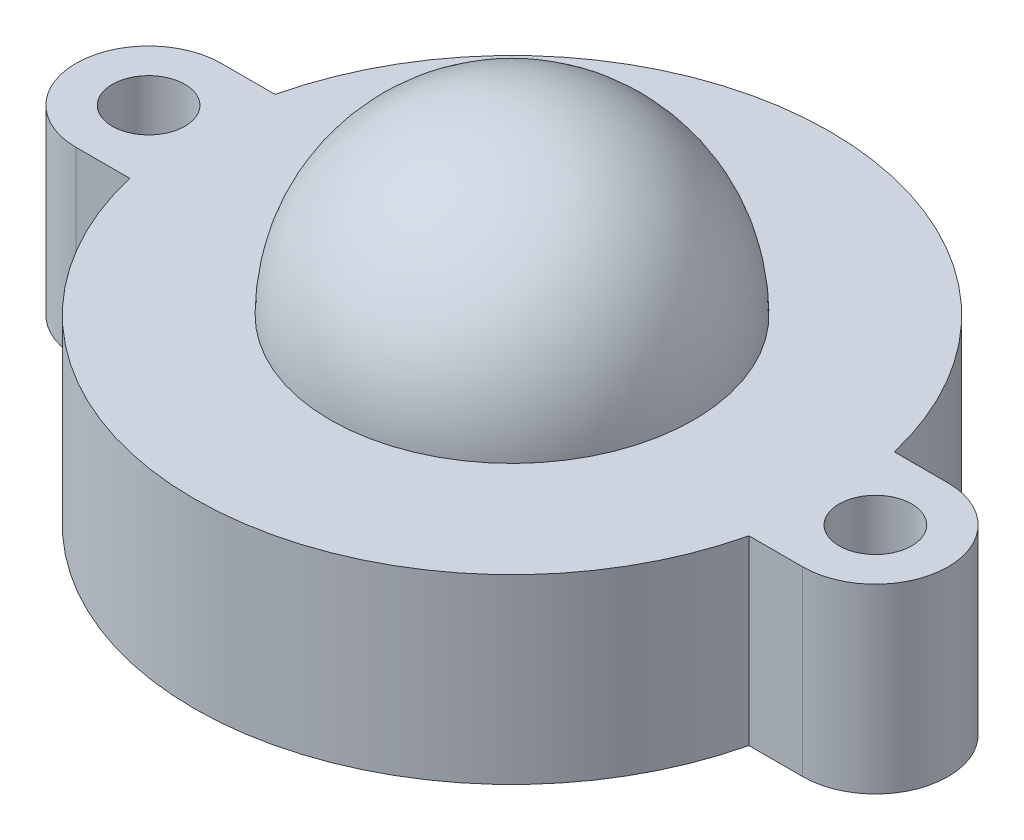
ISO-10303-21;
HEADER;
FILE_DESCRIPTION(('STEP AP214'),'2;1');
FILE_NAME('part.step','',(''),(''),'','','');
FILE_SCHEMA(('AUTOMOTIVE_DESIGN { 1 0 10303 214 1 1 1 1 }'));
ENDSEC;
DATA;
#1=APPLICATION_CONTEXT('core data for automotive mechanical design processes');
#2=APPLICATION_PROTOCOL_DEFINITION('international standard','automotive_design',2000,#1);
#3=PRODUCT_CONTEXT('',#1,'mechanical');
#4=PRODUCT('Part','Part','',(#3));
#5=PRODUCT_RELATED_PRODUCT_CATEGORY('part','',(#4));
#6=PRODUCT_DEFINITION_FORMATION('','',#4);
#7=PRODUCT_DEFINITION_CONTEXT('part definition',#1,'design');
#8=PRODUCT_DEFINITION('design','',#6,#7);
#9=PRODUCT_DEFINITION_SHAPE('','',#8);
#10=(LENGTH_UNIT() NAMED_UNIT(*) SI_UNIT(.MILLI.,.METRE.));
#11=(NAMED_UNIT(*) PLANE_ANGLE_UNIT() SI_UNIT($,.RADIAN.));
#12=(NAMED_UNIT(*) SI_UNIT($,.STERADIAN.) SOLID_ANGLE_UNIT());
#13=UNCERTAINTY_MEASURE_WITH_UNIT(LENGTH_MEASURE(1.E-05),#10,'distance_accuracy_value','');
#14=(GEOMETRIC_REPRESENTATION_CONTEXT(3) GLOBAL_UNCERTAINTY_ASSIGNED_CONTEXT((#13)) GLOBAL_UNIT_ASSIGNED_CONTEXT((#10,
#11,#12)) REPRESENTATION_CONTEXT('',''));
#15=CARTESIAN_POINT('',(0.,0.,0.));
#16=DIRECTION('',(0.,0.,1.));
#17=DIRECTION('',(1.,0.,0.));
#18=AXIS2_PLACEMENT_3D('',#15,#16,#17);
#19=CARTESIAN_POINT('',(20.,10.,0.));
#20=DIRECTION('',(0.,-1.,0.));
#21=DIRECTION('',(0.,0.,-1.));
#22=AXIS2_PLACEMENT_3D('',#19,#20,#21);
#23=CYLINDRICAL_SURFACE('',#22,4.);
#24=CARTESIAN_POINT('',(20.,0.,0.));
#25=DIRECTION('',(0.,1.,0.));
#26=DIRECTION('',(0.,0.,1.));
#27=AXIS2_PLACEMENT_3D('',#24,#25,#26);
#28=CIRCLE('',#27,4.);
#29=CARTESIAN_POINT('',(20.,0.,-4.));
#30=VERTEX_POINT('',#29);
#31=CARTESIAN_POINT('',(20.,0.,4.));
#32=VERTEX_POINT('',#31);
#33=EDGE_CURVE('E148',#30,#32,#28,.F.);
#34=ORIENTED_EDGE('',*,*,#33,.F.);
#35=DIRECTION('',(0.,-1.,0.));
#36=VECTOR('',#35,1.);
#37=CARTESIAN_POINT('',(20.,10.,-4.));
#38=LINE('',#37,#36);
#39=CARTESIAN_POINT('',(20.,10.,-4.));
#40=VERTEX_POINT('',#39);
#41=EDGE_CURVE('E11',#40,#30,#38,.T.);
#42=ORIENTED_EDGE('',*,*,#41,.F.);
#43=CARTESIAN_POINT('',(20.,10.,0.));
#44=DIRECTION('',(0.,1.,0.));
#45=DIRECTION('',(0.,0.,1.));
#46=AXIS2_PLACEMENT_3D('',#43,#44,#45);
#47=CIRCLE('',#46,4.);
#48=CARTESIAN_POINT('',(20.,10.,4.));
#49=VERTEX_POINT('',#48);
#50=EDGE_CURVE('E183',#40,#49,#47,.F.);
#51=ORIENTED_EDGE('',*,*,#50,.T.);
#52=DIRECTION('',(0.,-1.,0.));
#53=VECTOR('',#52,1.);
#54=CARTESIAN_POINT('',(20.,10.,4.));
#55=LINE('',#54,#53);
#56=EDGE_CURVE('E93',#49,#32,#55,.T.);
#57=ORIENTED_EDGE('',*,*,#56,.T.);
#58=EDGE_LOOP('',(#34,#42,#51,#57));
#59=FACE_BOUND('',#58,.T.);
#60=ADVANCED_FACE('F41',(#59),#23,.T.);
#61=CARTESIAN_POINT('',(0.,10.,-4.));
#62=DIRECTION('',(0.,0.,-1.));
#63=DIRECTION('',(-1.,0.,0.));
#64=AXIS2_PLACEMENT_3D('',#61,#62,#63);
#65=PLANE('',#64);
#66=DIRECTION('',(1.,0.,0.));
#67=VECTOR('',#66,1.);
#68=CARTESIAN_POINT('',(0.,0.,-4.));
#69=LINE('',#68,#67);
#70=CARTESIAN_POINT('',(17.0367250374008,0.,-4.));
#71=VERTEX_POINT('',#70);
#72=EDGE_CURVE('E152',#71,#30,#69,.T.);
#73=ORIENTED_EDGE('',*,*,#72,.F.);
#74=DIRECTION('',(0.,-1.,0.));
#75=VECTOR('',#74,1.);
#76=CARTESIAN_POINT('',(17.0367250374008,10.,-4.));
#77=LINE('',#76,#75);
#78=CARTESIAN_POINT('',(17.0367250374008,10.,-4.));
#79=VERTEX_POINT('',#78);
#80=EDGE_CURVE('E50',#79,#71,#77,.T.);
#81=ORIENTED_EDGE('',*,*,#80,.F.);
#82=DIRECTION('',(1.,0.,0.));
#83=VECTOR('',#82,1.);
#84=CARTESIAN_POINT('',(0.,10.,-4.));
#85=LINE('',#84,#83);
#86=EDGE_CURVE('E212',#79,#40,#85,.T.);
#87=ORIENTED_EDGE('',*,*,#86,.T.);
#88=ORIENTED_EDGE('',*,*,#41,.T.);
#89=EDGE_LOOP('',(#73,#81,#87,#88));
#90=FACE_BOUND('',#89,.T.);
#91=ADVANCED_FACE('F211',(#90),#65,.T.);
#92=CARTESIAN_POINT('',(0.,10.,0.));
#93=DIRECTION('',(0.,-1.,0.));
#94=DIRECTION('',(0.,0.,-1.));
#95=AXIS2_PLACEMENT_3D('',#92,#93,#94);
#96=CYLINDRICAL_SURFACE('',#95,17.5);
#97=CARTESIAN_POINT('',(0.,0.,0.));
#98=DIRECTION('',(0.,1.,0.));
#99=DIRECTION('',(0.,0.,1.));
#100=AXIS2_PLACEMENT_3D('',#97,#98,#99);
#101=CIRCLE('',#100,17.5);
#102=CARTESIAN_POINT('',(-17.0367250374008,0.,-4.));
#103=VERTEX_POINT('',#102);
#104=EDGE_CURVE('E157',#71,#103,#101,.T.);
#105=ORIENTED_EDGE('',*,*,#104,.T.);
#106=DIRECTION('',(0.,-1.,0.));
#107=VECTOR('',#106,1.);
#108=CARTESIAN_POINT('',(-17.0367250374008,10.,-4.));
#109=LINE('',#108,#107);
#110=CARTESIAN_POINT('',(-17.0367250374008,10.,-4.));
#111=VERTEX_POINT('',#110);
#112=EDGE_CURVE('E193',#111,#103,#109,.T.);
#113=ORIENTED_EDGE('',*,*,#112,.F.);
#114=CARTESIAN_POINT('',(0.,10.,0.));
#115=DIRECTION('',(0.,1.,0.));
#116=DIRECTION('',(0.,0.,1.));
#117=AXIS2_PLACEMENT_3D('',#114,#115,#116);
#118=CIRCLE('',#117,17.5);
#119=EDGE_CURVE('E201',#79,#111,#118,.T.);
#120=ORIENTED_EDGE('',*,*,#119,.F.);
#121=ORIENTED_EDGE('',*,*,#80,.T.);
#122=EDGE_LOOP('',(#105,#113,#120,#121));
#123=FACE_BOUND('',#122,.T.);
#124=ADVANCED_FACE('F199',(#123),#96,.T.);
#125=CARTESIAN_POINT('',(0.,10.,-4.));
#126=DIRECTION('',(0.,0.,-1.));
#127=DIRECTION('',(-1.,0.,0.));
#128=AXIS2_PLACEMENT_3D('',#125,#126,#127);
#129=PLANE('',#128);
#130=DIRECTION('',(1.,0.,0.));
#131=VECTOR('',#130,1.);
#132=CARTESIAN_POINT('',(0.,0.,-4.));
#133=LINE('',#132,#131);
#134=CARTESIAN_POINT('',(-20.,0.,-4.));
#135=VERTEX_POINT('',#134);
#136=EDGE_CURVE('E161',#135,#103,#133,.T.);
#137=ORIENTED_EDGE('',*,*,#136,.F.);
#138=DIRECTION('',(0.,-1.,0.));
#139=VECTOR('',#138,1.);
#140=CARTESIAN_POINT('',(-20.,10.,-4.));
#141=LINE('',#140,#139);
#142=CARTESIAN_POINT('',(-20.,10.,-4.));
#143=VERTEX_POINT('',#142);
#144=EDGE_CURVE('E190',#143,#135,#141,.T.);
#145=ORIENTED_EDGE('',*,*,#144,.F.);
#146=DIRECTION('',(1.,0.,0.));
#147=VECTOR('',#146,1.);
#148=CARTESIAN_POINT('',(0.,10.,-4.));
#149=LINE('',#148,#147);
#150=EDGE_CURVE('E224',#143,#111,#149,.T.);
#151=ORIENTED_EDGE('',*,*,#150,.T.);
#152=ORIENTED_EDGE('',*,*,#112,.T.);
#153=EDGE_LOOP('',(#137,#145,#151,#152));
#154=FACE_BOUND('',#153,.T.);
#155=ADVANCED_FACE('F229',(#154),#129,.T.);
#156=CARTESIAN_POINT('',(-20.,10.,0.));
#157=DIRECTION('',(0.,-1.,0.));
#158=DIRECTION('',(0.,0.,-1.));
#159=AXIS2_PLACEMENT_3D('',#156,#157,#158);
#160=CYLINDRICAL_SURFACE('',#159,4.);
#161=CARTESIAN_POINT('',(-20.,0.,0.));
#162=DIRECTION('',(0.,1.,0.));
#163=DIRECTION('',(0.,0.,1.));
#164=AXIS2_PLACEMENT_3D('',#161,#162,#163);
#165=CIRCLE('',#164,4.);
#166=CARTESIAN_POINT('',(-20.,0.,4.));
#167=VERTEX_POINT('',#166);
#168=EDGE_CURVE('E165',#135,#167,#165,.T.);
#169=ORIENTED_EDGE('',*,*,#168,.T.);
#170=DIRECTION('',(0.,-1.,0.));
#171=VECTOR('',#170,1.);
#172=CARTESIAN_POINT('',(-20.,10.,4.));
#173=LINE('',#172,#171);
#174=CARTESIAN_POINT('',(-20.,10.,4.));
#175=VERTEX_POINT('',#174);
#176=EDGE_CURVE('E130',#175,#167,#173,.T.);
#177=ORIENTED_EDGE('',*,*,#176,.F.);
#178=CARTESIAN_POINT('',(-20.,10.,0.));
#179=DIRECTION('',(0.,1.,0.));
#180=DIRECTION('',(0.,0.,1.));
#181=AXIS2_PLACEMENT_3D('',#178,#179,#180);
#182=CIRCLE('',#181,4.);
#183=EDGE_CURVE('E119',#143,#175,#182,.T.);
#184=ORIENTED_EDGE('',*,*,#183,.F.);
#185=ORIENTED_EDGE('',*,*,#144,.T.);
#186=EDGE_LOOP('',(#169,#177,#184,#185));
#187=FACE_BOUND('',#186,.T.);
#188=ADVANCED_FACE('F231',(#187),#160,.T.);
#189=CARTESIAN_POINT('',(0.,10.,4.));
#190=DIRECTION('',(0.,0.,-1.));
#191=DIRECTION('',(-1.,0.,0.));
#192=AXIS2_PLACEMENT_3D('',#189,#190,#191);
#193=PLANE('',#192);
#194=DIRECTION('',(1.,0.,0.));
#195=VECTOR('',#194,1.);
#196=CARTESIAN_POINT('',(0.,0.,4.));
#197=LINE('',#196,#195);
#198=CARTESIAN_POINT('',(-17.0367250374008,0.,4.));
#199=VERTEX_POINT('',#198);
#200=EDGE_CURVE('E128',#167,#199,#197,.T.);
#201=ORIENTED_EDGE('',*,*,#200,.T.);
#202=DIRECTION('',(0.,-1.,0.));
#203=VECTOR('',#202,1.);
#204=CARTESIAN_POINT('',(-17.0367250374008,10.,4.));
#205=LINE('',#204,#203);
#206=CARTESIAN_POINT('',(-17.0367250374008,10.,4.));
#207=VERTEX_POINT('',#206);
#208=EDGE_CURVE('E125',#207,#199,#205,.T.);
#209=ORIENTED_EDGE('',*,*,#208,.F.);
#210=DIRECTION('',(1.,0.,0.));
#211=VECTOR('',#210,1.);
#212=CARTESIAN_POINT('',(0.,10.,4.));
#213=LINE('',#212,#211);
#214=EDGE_CURVE('E111',#175,#207,#213,.T.);
#215=ORIENTED_EDGE('',*,*,#214,.F.);
#216=ORIENTED_EDGE('',*,*,#176,.T.);
#217=EDGE_LOOP('',(#201,#209,#215,#216));
#218=FACE_BOUND('',#217,.T.);
#219=ADVANCED_FACE('F126',(#218),#193,.F.);
#220=CARTESIAN_POINT('',(0.,10.,0.));
#221=DIRECTION('',(0.,-1.,0.));
#222=DIRECTION('',(0.,0.,-1.));
#223=AXIS2_PLACEMENT_3D('',#220,#221,#222);
#224=CYLINDRICAL_SURFACE('',#223,17.5);
#225=CARTESIAN_POINT('',(0.,0.,0.));
#226=DIRECTION('',(0.,1.,0.));
#227=DIRECTION('',(0.,0.,1.));
#228=AXIS2_PLACEMENT_3D('',#225,#226,#227);
#229=CIRCLE('',#228,17.5);
#230=CARTESIAN_POINT('',(17.0367250374008,0.,4.));
#231=VERTEX_POINT('',#230);
#232=EDGE_CURVE('E86',#199,#231,#229,.T.);
#233=ORIENTED_EDGE('',*,*,#232,.T.);
#234=DIRECTION('',(0.,-1.,0.));
#235=VECTOR('',#234,1.);
#236=CARTESIAN_POINT('',(17.0367250374008,10.,4.));
#237=LINE('',#236,#235);
#238=CARTESIAN_POINT('',(17.0367250374008,10.,4.));
#239=VERTEX_POINT('',#238);
#240=EDGE_CURVE('E131',#239,#231,#237,.T.);
#241=ORIENTED_EDGE('',*,*,#240,.F.);
#242=CARTESIAN_POINT('',(0.,10.,0.));
#243=DIRECTION('',(0.,1.,0.));
#244=DIRECTION('',(0.,0.,1.));
#245=AXIS2_PLACEMENT_3D('',#242,#243,#244);
#246=CIRCLE('',#245,17.5);
#247=EDGE_CURVE('E116',#207,#239,#246,.T.);
#248=ORIENTED_EDGE('',*,*,#247,.F.);
#249=ORIENTED_EDGE('',*,*,#208,.T.);
#250=EDGE_LOOP('',(#233,#241,#248,#249));
#251=FACE_BOUND('',#250,.T.);
#252=ADVANCED_FACE('F133',(#251),#224,.T.);
#253=CARTESIAN_POINT('',(-20.,10.,0.));
#254=DIRECTION('',(0.,-1.,0.));
#255=DIRECTION('',(0.,0.,-1.));
#256=AXIS2_PLACEMENT_3D('',#253,#254,#255);
#257=CYLINDRICAL_SURFACE('',#256,2.);
#258=CARTESIAN_POINT('',(-20.,10.,0.));
#259=DIRECTION('',(0.,1.,0.));
#260=DIRECTION('',(0.,0.,1.));
#261=AXIS2_PLACEMENT_3D('',#258,#259,#260);
#262=CIRCLE('',#261,2.);
#263=CARTESIAN_POINT('',(-20.,10.,2.));
#264=VERTEX_POINT('',#263);
#265=EDGE_CURVE('E137',#264,#264,#262,.T.);
#266=ORIENTED_EDGE('',*,*,#265,.T.);
#267=EDGE_LOOP('',(#266));
#268=FACE_BOUND('',#267,.T.);
#269=CARTESIAN_POINT('',(-20.,0.,0.));
#270=DIRECTION('',(0.,1.,0.));
#271=DIRECTION('',(0.,0.,1.));
#272=AXIS2_PLACEMENT_3D('',#269,#270,#271);
#273=CIRCLE('',#272,2.);
#274=CARTESIAN_POINT('',(-20.,0.,2.));
#275=VERTEX_POINT('',#274);
#276=EDGE_CURVE('E175',#275,#275,#273,.T.);
#277=ORIENTED_EDGE('',*,*,#276,.F.);
#278=EDGE_LOOP('',(#277));
#279=FACE_BOUND('',#278,.T.);
#280=ADVANCED_FACE('F273',(#268,#279),#257,.F.);
#281=CARTESIAN_POINT('',(0.,10.,4.));
#282=DIRECTION('',(0.,0.,-1.));
#283=DIRECTION('',(-1.,0.,0.));
#284=AXIS2_PLACEMENT_3D('',#281,#282,#283);
#285=PLANE('',#284);
#286=DIRECTION('',(1.,0.,0.));
#287=VECTOR('',#286,1.);
#288=CARTESIAN_POINT('',(0.,0.,4.));
#289=LINE('',#288,#287);
#290=EDGE_CURVE('E172',#231,#32,#289,.T.);
#291=ORIENTED_EDGE('',*,*,#290,.T.);
#292=ORIENTED_EDGE('',*,*,#56,.F.);
#293=DIRECTION('',(1.,0.,0.));
#294=VECTOR('',#293,1.);
#295=CARTESIAN_POINT('',(0.,10.,4.));
#296=LINE('',#295,#294);
#297=EDGE_CURVE('E58',#239,#49,#296,.T.);
#298=ORIENTED_EDGE('',*,*,#297,.F.);
#299=ORIENTED_EDGE('',*,*,#240,.T.);
#300=EDGE_LOOP('',(#291,#292,#298,#299));
#301=FACE_BOUND('',#300,.T.);
#302=ADVANCED_FACE('F215',(#301),#285,.F.);
#303=CARTESIAN_POINT('',(20.,10.,0.));
#304=DIRECTION('',(0.,-1.,0.));
#305=DIRECTION('',(0.,0.,-1.));
#306=AXIS2_PLACEMENT_3D('',#303,#304,#305);
#307=CYLINDRICAL_SURFACE('',#306,2.);
#308=CARTESIAN_POINT('',(20.,10.,0.));
#309=DIRECTION('',(0.,1.,0.));
#310=DIRECTION('',(0.,0.,1.));
#311=AXIS2_PLACEMENT_3D('',#308,#309,#310);
#312=CIRCLE('',#311,2.);
#313=CARTESIAN_POINT('',(20.,10.,2.));
#314=VERTEX_POINT('',#313);
#315=EDGE_CURVE('E144',#314,#314,#312,.T.);
#316=ORIENTED_EDGE('',*,*,#315,.T.);
#317=EDGE_LOOP('',(#316));
#318=FACE_BOUND('',#317,.T.);
#319=CARTESIAN_POINT('',(20.,0.,0.));
#320=DIRECTION('',(0.,1.,0.));
#321=DIRECTION('',(0.,0.,1.));
#322=AXIS2_PLACEMENT_3D('',#319,#320,#321);
#323=CIRCLE('',#322,2.);
#324=CARTESIAN_POINT('',(20.,0.,2.));
#325=VERTEX_POINT('',#324);
#326=EDGE_CURVE('E179',#325,#325,#323,.T.);
#327=ORIENTED_EDGE('',*,*,#326,.F.);
#328=EDGE_LOOP('',(#327));
#329=FACE_BOUND('',#328,.T.);
#330=ADVANCED_FACE('F291',(#318,#329),#307,.F.);
#331=CARTESIAN_POINT('',(0.,10.,0.));
#332=DIRECTION('',(0.,1.,0.));
#333=DIRECTION('',(0.,0.,1.));
#334=AXIS2_PLACEMENT_3D('',#331,#332,#333);
#335=PLANE('',#334);
#336=CARTESIAN_POINT('',(0.,10.,0.));
#337=DIRECTION('',(0.,-1.,0.));
#338=DIRECTION('',(0.,0.,1.));
#339=AXIS2_PLACEMENT_3D('',#336,#337,#338);
#340=CIRCLE('',#339,10.);
#341=CARTESIAN_POINT('',(0.,10.,10.));
#342=VERTEX_POINT('',#341);
#343=EDGE_CURVE('E153',#342,#342,#340,.T.);
#344=ORIENTED_EDGE('',*,*,#343,.T.);
#345=EDGE_LOOP('',(#344));
#346=FACE_BOUND('',#345,.T.);
#347=ORIENTED_EDGE('',*,*,#50,.F.);
#348=ORIENTED_EDGE('',*,*,#86,.F.);
#349=ORIENTED_EDGE('',*,*,#119,.T.);
#350=ORIENTED_EDGE('',*,*,#150,.F.);
#351=ORIENTED_EDGE('',*,*,#183,.T.);
#352=ORIENTED_EDGE('',*,*,#214,.T.);
#353=ORIENTED_EDGE('',*,*,#247,.T.);
#354=ORIENTED_EDGE('',*,*,#297,.T.);
#355=EDGE_LOOP('',(#347,#348,#349,#350,#351,#352,#353,#354));
#356=FACE_BOUND('',#355,.T.);
#357=ORIENTED_EDGE('',*,*,#265,.F.);
#358=EDGE_LOOP('',(#357));
#359=FACE_BOUND('',#358,.T.);
#360=ORIENTED_EDGE('',*,*,#315,.F.);
#361=EDGE_LOOP('',(#360));
#362=FACE_BOUND('',#361,.T.);
#363=ADVANCED_FACE('F113',(#346,#356,#359,#362),#335,.T.);
#364=CARTESIAN_POINT('',(0.,0.,0.));
#365=DIRECTION('',(0.,1.,0.));
#366=DIRECTION('',(0.,0.,1.));
#367=AXIS2_PLACEMENT_3D('',#364,#365,#366);
#368=PLANE('',#367);
#369=ORIENTED_EDGE('',*,*,#33,.T.);
#370=ORIENTED_EDGE('',*,*,#290,.F.);
#371=ORIENTED_EDGE('',*,*,#232,.F.);
#372=ORIENTED_EDGE('',*,*,#200,.F.);
#373=ORIENTED_EDGE('',*,*,#168,.F.);
#374=ORIENTED_EDGE('',*,*,#136,.T.);
#375=ORIENTED_EDGE('',*,*,#104,.F.);
#376=ORIENTED_EDGE('',*,*,#72,.T.);
#377=EDGE_LOOP('',(#369,#370,#371,#372,#373,#374,#375,#376));
#378=FACE_BOUND('',#377,.T.);
#379=ORIENTED_EDGE('',*,*,#276,.T.);
#380=EDGE_LOOP('',(#379));
#381=FACE_BOUND('',#380,.T.);
#382=ORIENTED_EDGE('',*,*,#326,.T.);
#383=EDGE_LOOP('',(#382));
#384=FACE_BOUND('',#383,.T.);
#385=ADVANCED_FACE('F207',(#378,#381,#384),#368,.F.);
#386=CARTESIAN_POINT('',(0.,10.,0.));
#387=DIRECTION('',(0.,0.,1.));
#388=DIRECTION('',(-1.,0.,0.));
#389=AXIS2_PLACEMENT_3D('',#386,#387,#388);
#390=SPHERICAL_SURFACE('',#389,10.);
#391=CARTESIAN_POINT('',(0.,10.,0.));
#392=DIRECTION('',(0.,-1.,0.));
#393=DIRECTION('',(0.,0.,1.));
#394=AXIS2_PLACEMENT_3D('',#391,#392,#393);
#395=SPHERICAL_SURFACE('',#394,10.);
#396=ORIENTED_EDGE('',*,*,#343,.F.);
#397=EDGE_LOOP('',(#396));
#398=FACE_BOUND('',#397,.T.);
#399=ADVANCED_FACE('F311',(#398),#395,.T.);
#400=CLOSED_SHELL('',(#60,#91,#124,#155,#188,#219,#252,#280,#302,#330,#363,#385,#399));
#401=MANIFOLD_SOLID_BREP('B2',#400);
#402=ADVANCED_BREP_SHAPE_REPRESENTATION('',(#18,#401),#14);
#403=SHAPE_DEFINITION_REPRESENTATION(#9,#402);
ENDSEC;
END-ISO-10303-21;
